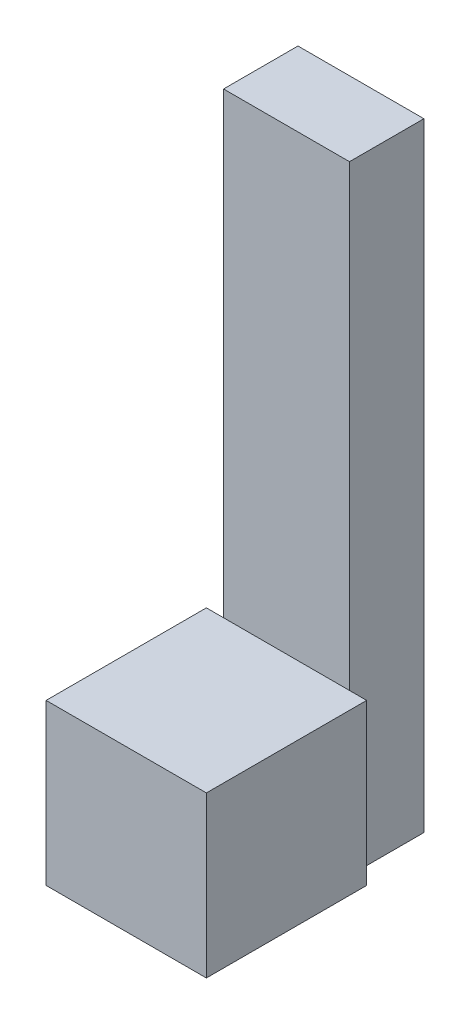
ISO-10303-21;
HEADER;
FILE_DESCRIPTION(('STEP AP214'),'2;1');
FILE_NAME('part.step','',(''),(''),'','','');
FILE_SCHEMA(('AUTOMOTIVE_DESIGN { 1 0 10303 214 1 1 1 1 }'));
ENDSEC;
DATA;
#1=APPLICATION_CONTEXT('core data for automotive mechanical design processes');
#2=APPLICATION_PROTOCOL_DEFINITION('international standard','automotive_design',2000,#1);
#3=PRODUCT_CONTEXT('',#1,'mechanical');
#4=PRODUCT('Part','Part','',(#3));
#5=PRODUCT_RELATED_PRODUCT_CATEGORY('part','',(#4));
#6=PRODUCT_DEFINITION_FORMATION('','',#4);
#7=PRODUCT_DEFINITION_CONTEXT('part definition',#1,'design');
#8=PRODUCT_DEFINITION('design','',#6,#7);
#9=PRODUCT_DEFINITION_SHAPE('','',#8);
#10=(LENGTH_UNIT() NAMED_UNIT(*) SI_UNIT(.MILLI.,.METRE.));
#11=(NAMED_UNIT(*) PLANE_ANGLE_UNIT() SI_UNIT($,.RADIAN.));
#12=(NAMED_UNIT(*) SI_UNIT($,.STERADIAN.) SOLID_ANGLE_UNIT());
#13=UNCERTAINTY_MEASURE_WITH_UNIT(LENGTH_MEASURE(1.E-05),#10,'distance_accuracy_value','');
#14=(GEOMETRIC_REPRESENTATION_CONTEXT(3) GLOBAL_UNCERTAINTY_ASSIGNED_CONTEXT((#13)) GLOBAL_UNIT_ASSIGNED_CONTEXT((#10,
#11,#12)) REPRESENTATION_CONTEXT('',''));
#15=CARTESIAN_POINT('',(0.,0.,0.));
#16=DIRECTION('',(0.,0.,1.));
#17=DIRECTION('',(1.,0.,0.));
#18=AXIS2_PLACEMENT_3D('',#15,#16,#17);
#19=CARTESIAN_POINT('',(5.5,27.,3.25));
#20=DIRECTION('',(-1.,0.,0.));
#21=DIRECTION('',(0.,-1.,0.));
#22=AXIS2_PLACEMENT_3D('',#19,#20,#21);
#23=PLANE('',#22);
#24=DIRECTION('',(0.,1.,0.));
#25=VECTOR('',#24,1.);
#26=CARTESIAN_POINT('',(5.5,27.,-3.25));
#27=LINE('',#26,#25);
#28=CARTESIAN_POINT('',(5.50000000000001,-27.,-3.25));
#29=VERTEX_POINT('',#28);
#30=CARTESIAN_POINT('',(5.5,27.,-3.25));
#31=VERTEX_POINT('',#30);
#32=EDGE_CURVE('E143',#29,#31,#27,.T.);
#33=ORIENTED_EDGE('',*,*,#32,.T.);
#34=DIRECTION('',(0.,0.,-1.));
#35=VECTOR('',#34,1.);
#36=CARTESIAN_POINT('',(5.5,27.,3.25));
#37=LINE('',#36,#35);
#38=CARTESIAN_POINT('',(5.5,27.,3.25));
#39=VERTEX_POINT('',#38);
#40=EDGE_CURVE('E45',#39,#31,#37,.T.);
#41=ORIENTED_EDGE('',*,*,#40,.F.);
#42=DIRECTION('',(0.,1.,0.));
#43=VECTOR('',#42,1.);
#44=CARTESIAN_POINT('',(5.5,27.,3.25));
#45=LINE('',#44,#43);
#46=CARTESIAN_POINT('',(5.5,-13.,3.25));
#47=VERTEX_POINT('',#46);
#48=EDGE_CURVE('E88',#47,#39,#45,.T.);
#49=ORIENTED_EDGE('',*,*,#48,.F.);
#50=CARTESIAN_POINT('',(5.50000000000001,-27.,3.25));
#51=VERTEX_POINT('',#50);
#52=EDGE_CURVE('E147',#51,#47,#45,.T.);
#53=ORIENTED_EDGE('',*,*,#52,.F.);
#54=DIRECTION('',(0.,0.,-1.));
#55=VECTOR('',#54,1.);
#56=CARTESIAN_POINT('',(5.50000000000001,-27.,3.25));
#57=LINE('',#56,#55);
#58=EDGE_CURVE('E64',#51,#29,#57,.T.);
#59=ORIENTED_EDGE('',*,*,#58,.T.);
#60=EDGE_LOOP('',(#33,#41,#49,#53,#59));
#61=FACE_BOUND('',#60,.T.);
#62=ADVANCED_FACE('F39',(#61),#23,.F.);
#63=CARTESIAN_POINT('',(-5.5,27.,3.25));
#64=DIRECTION('',(0.,-1.,0.));
#65=DIRECTION('',(0.,0.,-1.));
#66=AXIS2_PLACEMENT_3D('',#63,#64,#65);
#67=PLANE('',#66);
#68=DIRECTION('',(-1.,0.,0.));
#69=VECTOR('',#68,1.);
#70=CARTESIAN_POINT('',(-5.5,27.,-3.25));
#71=LINE('',#70,#69);
#72=CARTESIAN_POINT('',(-5.5,27.,-3.25));
#73=VERTEX_POINT('',#72);
#74=EDGE_CURVE('E145',#31,#73,#71,.T.);
#75=ORIENTED_EDGE('',*,*,#74,.T.);
#76=DIRECTION('',(0.,0.,-1.));
#77=VECTOR('',#76,1.);
#78=CARTESIAN_POINT('',(-5.5,27.,3.25));
#79=LINE('',#78,#77);
#80=CARTESIAN_POINT('',(-5.5,27.,3.25));
#81=VERTEX_POINT('',#80);
#82=EDGE_CURVE('E163',#81,#73,#79,.T.);
#83=ORIENTED_EDGE('',*,*,#82,.F.);
#84=DIRECTION('',(-1.,0.,0.));
#85=VECTOR('',#84,1.);
#86=CARTESIAN_POINT('',(-5.5,27.,3.25));
#87=LINE('',#86,#85);
#88=EDGE_CURVE('E153',#39,#81,#87,.T.);
#89=ORIENTED_EDGE('',*,*,#88,.F.);
#90=ORIENTED_EDGE('',*,*,#40,.T.);
#91=EDGE_LOOP('',(#75,#83,#89,#90));
#92=FACE_BOUND('',#91,.T.);
#93=ADVANCED_FACE('F174',(#92),#67,.F.);
#94=CARTESIAN_POINT('',(-5.5,27.,3.25));
#95=DIRECTION('',(1.,0.,0.));
#96=DIRECTION('',(0.,1.,0.));
#97=AXIS2_PLACEMENT_3D('',#94,#95,#96);
#98=PLANE('',#97);
#99=DIRECTION('',(0.,-1.,0.));
#100=VECTOR('',#99,1.);
#101=CARTESIAN_POINT('',(-5.5,27.,-3.25));
#102=LINE('',#101,#100);
#103=CARTESIAN_POINT('',(-5.49999999999999,-27.,-3.25));
#104=VERTEX_POINT('',#103);
#105=EDGE_CURVE('E157',#73,#104,#102,.T.);
#106=ORIENTED_EDGE('',*,*,#105,.T.);
#107=DIRECTION('',(0.,0.,-1.));
#108=VECTOR('',#107,1.);
#109=CARTESIAN_POINT('',(-5.49999999999999,-27.,3.25));
#110=LINE('',#109,#108);
#111=CARTESIAN_POINT('',(-5.49999999999999,-27.,3.25));
#112=VERTEX_POINT('',#111);
#113=EDGE_CURVE('E162',#112,#104,#110,.T.);
#114=ORIENTED_EDGE('',*,*,#113,.F.);
#115=DIRECTION('',(0.,-1.,0.));
#116=VECTOR('',#115,1.);
#117=CARTESIAN_POINT('',(-5.5,27.,3.25));
#118=LINE('',#117,#116);
#119=CARTESIAN_POINT('',(-5.5,-13.,3.25));
#120=VERTEX_POINT('',#119);
#121=EDGE_CURVE('E154',#120,#112,#118,.T.);
#122=ORIENTED_EDGE('',*,*,#121,.F.);
#123=EDGE_CURVE('E156',#81,#120,#118,.T.);
#124=ORIENTED_EDGE('',*,*,#123,.F.);
#125=ORIENTED_EDGE('',*,*,#82,.T.);
#126=EDGE_LOOP('',(#106,#114,#122,#124,#125));
#127=FACE_BOUND('',#126,.T.);
#128=ADVANCED_FACE('F177',(#127),#98,.F.);
#129=CARTESIAN_POINT('',(-5.49999999999999,-27.,3.25));
#130=DIRECTION('',(0.,1.,0.));
#131=DIRECTION('',(0.,0.,1.));
#132=AXIS2_PLACEMENT_3D('',#129,#130,#131);
#133=PLANE('',#132);
#134=DIRECTION('',(1.,0.,0.));
#135=VECTOR('',#134,1.);
#136=CARTESIAN_POINT('',(-5.49999999999999,-27.,-3.25));
#137=LINE('',#136,#135);
#138=EDGE_CURVE('E82',#104,#29,#137,.T.);
#139=ORIENTED_EDGE('',*,*,#138,.T.);
#140=ORIENTED_EDGE('',*,*,#58,.F.);
#141=DIRECTION('',(1.,0.,0.));
#142=VECTOR('',#141,1.);
#143=CARTESIAN_POINT('',(-6.99999999999999,-27.,3.25));
#144=LINE('',#143,#142);
#145=CARTESIAN_POINT('',(7.00000000000002,-27.,3.25));
#146=VERTEX_POINT('',#145);
#147=EDGE_CURVE('E189',#51,#146,#144,.T.);
#148=ORIENTED_EDGE('',*,*,#147,.T.);
#149=DIRECTION('',(0.,0.,-1.));
#150=VECTOR('',#149,1.);
#151=CARTESIAN_POINT('',(7.00000000000002,-27.,17.25));
#152=LINE('',#151,#150);
#153=CARTESIAN_POINT('',(7.00000000000002,-27.,17.25));
#154=VERTEX_POINT('',#153);
#155=EDGE_CURVE('E192',#154,#146,#152,.T.);
#156=ORIENTED_EDGE('',*,*,#155,.F.);
#157=DIRECTION('',(1.,0.,0.));
#158=VECTOR('',#157,1.);
#159=CARTESIAN_POINT('',(-6.99999999999999,-27.,17.25));
#160=LINE('',#159,#158);
#161=CARTESIAN_POINT('',(-6.99999999999999,-27.,17.25));
#162=VERTEX_POINT('',#161);
#163=EDGE_CURVE('E135',#162,#154,#160,.T.);
#164=ORIENTED_EDGE('',*,*,#163,.F.);
#165=DIRECTION('',(0.,0.,-1.));
#166=VECTOR('',#165,1.);
#167=CARTESIAN_POINT('',(-6.99999999999999,-27.,17.25));
#168=LINE('',#167,#166);
#169=CARTESIAN_POINT('',(-6.99999999999999,-27.,3.25));
#170=VERTEX_POINT('',#169);
#171=EDGE_CURVE('E148',#162,#170,#168,.T.);
#172=ORIENTED_EDGE('',*,*,#171,.T.);
#173=EDGE_CURVE('E136',#170,#112,#144,.T.);
#174=ORIENTED_EDGE('',*,*,#173,.T.);
#175=ORIENTED_EDGE('',*,*,#113,.T.);
#176=EDGE_LOOP('',(#139,#140,#148,#156,#164,#172,#174,#175));
#177=FACE_BOUND('',#176,.T.);
#178=ADVANCED_FACE('F185',(#177),#133,.F.);
#179=CARTESIAN_POINT('',(0.,0.,3.25));
#180=DIRECTION('',(0.,0.,1.));
#181=DIRECTION('',(1.,0.,0.));
#182=AXIS2_PLACEMENT_3D('',#179,#180,#181);
#183=PLANE('',#182);
#184=DIRECTION('',(-1.,0.,0.));
#185=VECTOR('',#184,1.);
#186=CARTESIAN_POINT('',(-6.99999999999999,-13.,3.25));
#187=LINE('',#186,#185);
#188=EDGE_CURVE('E11',#47,#120,#187,.T.);
#189=ORIENTED_EDGE('',*,*,#188,.F.);
#190=ORIENTED_EDGE('',*,*,#48,.T.);
#191=ORIENTED_EDGE('',*,*,#88,.T.);
#192=ORIENTED_EDGE('',*,*,#123,.T.);
#193=EDGE_LOOP('',(#189,#190,#191,#192));
#194=FACE_BOUND('',#193,.T.);
#195=ADVANCED_FACE('F221',(#194),#183,.T.);
#196=CARTESIAN_POINT('',(0.,0.,-3.25));
#197=DIRECTION('',(0.,0.,1.));
#198=DIRECTION('',(1.,0.,0.));
#199=AXIS2_PLACEMENT_3D('',#196,#197,#198);
#200=PLANE('',#199);
#201=ORIENTED_EDGE('',*,*,#32,.F.);
#202=ORIENTED_EDGE('',*,*,#138,.F.);
#203=ORIENTED_EDGE('',*,*,#105,.F.);
#204=ORIENTED_EDGE('',*,*,#74,.F.);
#205=EDGE_LOOP('',(#201,#202,#203,#204));
#206=FACE_BOUND('',#205,.T.);
#207=ADVANCED_FACE('F180',(#206),#200,.F.);
#208=CARTESIAN_POINT('',(0.,0.,3.25));
#209=DIRECTION('',(0.,0.,1.));
#210=DIRECTION('',(1.,0.,0.));
#211=AXIS2_PLACEMENT_3D('',#208,#209,#210);
#212=PLANE('',#211);
#213=ORIENTED_EDGE('',*,*,#147,.F.);
#214=ORIENTED_EDGE('',*,*,#52,.T.);
#215=CARTESIAN_POINT('',(7.00000000000001,-13.,3.25));
#216=VERTEX_POINT('',#215);
#217=EDGE_CURVE('E48',#216,#47,#187,.T.);
#218=ORIENTED_EDGE('',*,*,#217,.F.);
#219=DIRECTION('',(0.,1.,0.));
#220=VECTOR('',#219,1.);
#221=CARTESIAN_POINT('',(7.00000000000001,-13.,3.25));
#222=LINE('',#221,#220);
#223=EDGE_CURVE('E139',#146,#216,#222,.T.);
#224=ORIENTED_EDGE('',*,*,#223,.F.);
#225=EDGE_LOOP('',(#213,#214,#218,#224));
#226=FACE_BOUND('',#225,.T.);
#227=ADVANCED_FACE('F205',(#226),#212,.F.);
#228=CARTESIAN_POINT('',(-6.99999999999999,-13.,3.25));
#229=VERTEX_POINT('',#228);
#230=EDGE_CURVE('E47',#120,#229,#187,.T.);
#231=ORIENTED_EDGE('',*,*,#230,.F.);
#232=ORIENTED_EDGE('',*,*,#121,.T.);
#233=ORIENTED_EDGE('',*,*,#173,.F.);
#234=DIRECTION('',(0.,-1.,0.));
#235=VECTOR('',#234,1.);
#236=CARTESIAN_POINT('',(-6.99999999999999,-13.,3.25));
#237=LINE('',#236,#235);
#238=EDGE_CURVE('E188',#229,#170,#237,.T.);
#239=ORIENTED_EDGE('',*,*,#238,.F.);
#240=EDGE_LOOP('',(#231,#232,#233,#239));
#241=FACE_BOUND('',#240,.T.);
#242=ADVANCED_FACE('F199',(#241),#212,.F.);
#243=CARTESIAN_POINT('',(7.00000000000001,-13.,17.25));
#244=DIRECTION('',(-1.,0.,0.));
#245=DIRECTION('',(0.,-1.,0.));
#246=AXIS2_PLACEMENT_3D('',#243,#244,#245);
#247=PLANE('',#246);
#248=ORIENTED_EDGE('',*,*,#223,.T.);
#249=DIRECTION('',(0.,0.,-1.));
#250=VECTOR('',#249,1.);
#251=CARTESIAN_POINT('',(7.00000000000001,-13.,17.25));
#252=LINE('',#251,#250);
#253=CARTESIAN_POINT('',(7.00000000000001,-13.,17.25));
#254=VERTEX_POINT('',#253);
#255=EDGE_CURVE('E118',#254,#216,#252,.T.);
#256=ORIENTED_EDGE('',*,*,#255,.F.);
#257=DIRECTION('',(0.,1.,0.));
#258=VECTOR('',#257,1.);
#259=CARTESIAN_POINT('',(7.00000000000001,-13.,17.25));
#260=LINE('',#259,#258);
#261=EDGE_CURVE('E130',#154,#254,#260,.T.);
#262=ORIENTED_EDGE('',*,*,#261,.F.);
#263=ORIENTED_EDGE('',*,*,#155,.T.);
#264=EDGE_LOOP('',(#248,#256,#262,#263));
#265=FACE_BOUND('',#264,.T.);
#266=ADVANCED_FACE('F137',(#265),#247,.F.);
#267=CARTESIAN_POINT('',(-6.99999999999999,-13.,17.25));
#268=DIRECTION('',(0.,-1.,0.));
#269=DIRECTION('',(0.,0.,-1.));
#270=AXIS2_PLACEMENT_3D('',#267,#268,#269);
#271=PLANE('',#270);
#272=ORIENTED_EDGE('',*,*,#217,.T.);
#273=ORIENTED_EDGE('',*,*,#188,.T.);
#274=ORIENTED_EDGE('',*,*,#230,.T.);
#275=DIRECTION('',(0.,0.,-1.));
#276=VECTOR('',#275,1.);
#277=CARTESIAN_POINT('',(-6.99999999999999,-13.,17.25));
#278=LINE('',#277,#276);
#279=CARTESIAN_POINT('',(-6.99999999999999,-13.,17.25));
#280=VERTEX_POINT('',#279);
#281=EDGE_CURVE('E122',#280,#229,#278,.T.);
#282=ORIENTED_EDGE('',*,*,#281,.F.);
#283=DIRECTION('',(-1.,0.,0.));
#284=VECTOR('',#283,1.);
#285=CARTESIAN_POINT('',(-6.99999999999999,-13.,17.25));
#286=LINE('',#285,#284);
#287=EDGE_CURVE('E113',#254,#280,#286,.T.);
#288=ORIENTED_EDGE('',*,*,#287,.F.);
#289=ORIENTED_EDGE('',*,*,#255,.T.);
#290=EDGE_LOOP('',(#272,#273,#274,#282,#288,#289));
#291=FACE_BOUND('',#290,.T.);
#292=ADVANCED_FACE('F119',(#291),#271,.F.);
#293=CARTESIAN_POINT('',(-6.99999999999999,-13.,17.25));
#294=DIRECTION('',(1.,0.,0.));
#295=DIRECTION('',(0.,1.,0.));
#296=AXIS2_PLACEMENT_3D('',#293,#294,#295);
#297=PLANE('',#296);
#298=ORIENTED_EDGE('',*,*,#238,.T.);
#299=ORIENTED_EDGE('',*,*,#171,.F.);
#300=DIRECTION('',(0.,-1.,0.));
#301=VECTOR('',#300,1.);
#302=CARTESIAN_POINT('',(-6.99999999999999,-13.,17.25));
#303=LINE('',#302,#301);
#304=EDGE_CURVE('E127',#280,#162,#303,.T.);
#305=ORIENTED_EDGE('',*,*,#304,.F.);
#306=ORIENTED_EDGE('',*,*,#281,.T.);
#307=EDGE_LOOP('',(#298,#299,#305,#306));
#308=FACE_BOUND('',#307,.T.);
#309=ADVANCED_FACE('F200',(#308),#297,.F.);
#310=CARTESIAN_POINT('',(0.,0.,17.25));
#311=DIRECTION('',(0.,0.,1.));
#312=DIRECTION('',(1.,0.,0.));
#313=AXIS2_PLACEMENT_3D('',#310,#311,#312);
#314=PLANE('',#313);
#315=ORIENTED_EDGE('',*,*,#261,.T.);
#316=ORIENTED_EDGE('',*,*,#287,.T.);
#317=ORIENTED_EDGE('',*,*,#304,.T.);
#318=ORIENTED_EDGE('',*,*,#163,.T.);
#319=EDGE_LOOP('',(#315,#316,#317,#318));
#320=FACE_BOUND('',#319,.T.);
#321=ADVANCED_FACE('F128',(#320),#314,.T.);
#322=CLOSED_SHELL('',(#62,#93,#128,#178,#195,#207,#227,#242,#266,#292,#309,#321));
#323=MANIFOLD_SOLID_BREP('B2',#322);
#324=ADVANCED_BREP_SHAPE_REPRESENTATION('',(#18,#323),#14);
#325=SHAPE_DEFINITION_REPRESENTATION(#9,#324);
ENDSEC;
END-ISO-10303-21;
